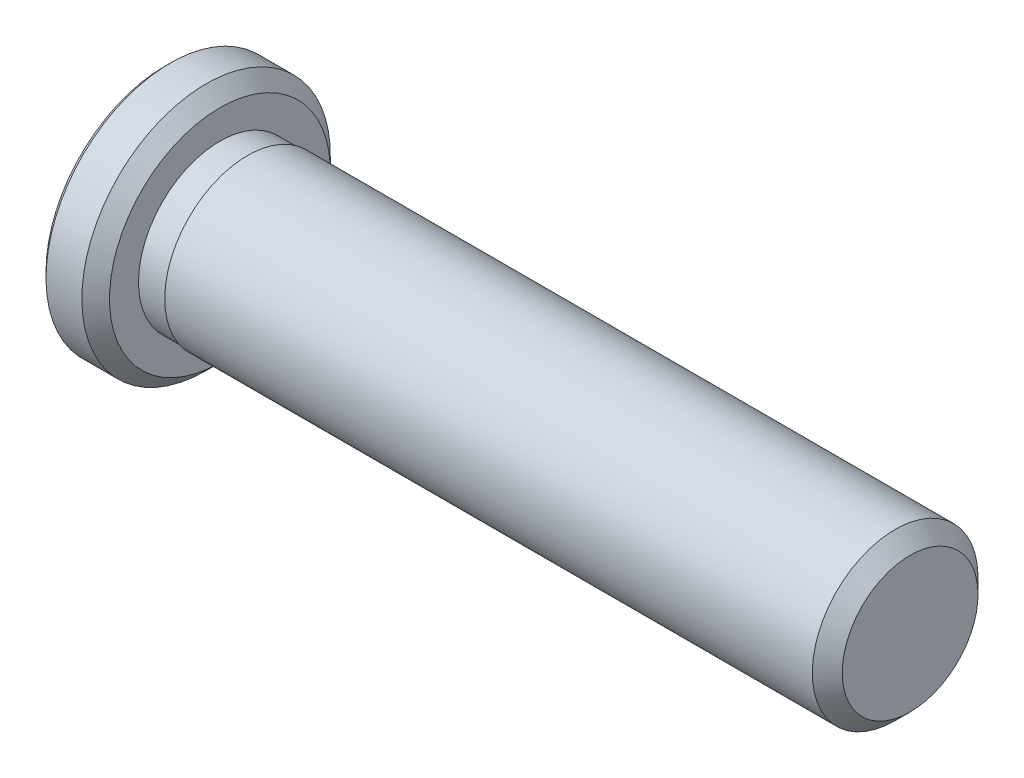
ISO-10303-21;
HEADER;
FILE_DESCRIPTION(('STEP AP214'),'2;1');
FILE_NAME('part.step','',(''),(''),'','','');
FILE_SCHEMA(('AUTOMOTIVE_DESIGN { 1 0 10303 214 1 1 1 1 }'));
ENDSEC;
DATA;
#1=APPLICATION_CONTEXT('core data for automotive mechanical design processes');
#2=APPLICATION_PROTOCOL_DEFINITION('international standard','automotive_design',2000,#1);
#3=PRODUCT_CONTEXT('',#1,'mechanical');
#4=PRODUCT('Part','Part','',(#3));
#5=PRODUCT_RELATED_PRODUCT_CATEGORY('part','',(#4));
#6=PRODUCT_DEFINITION_FORMATION('','',#4);
#7=PRODUCT_DEFINITION_CONTEXT('part definition',#1,'design');
#8=PRODUCT_DEFINITION('design','',#6,#7);
#9=PRODUCT_DEFINITION_SHAPE('','',#8);
#10=(LENGTH_UNIT() NAMED_UNIT(*) SI_UNIT(.MILLI.,.METRE.));
#11=(NAMED_UNIT(*) PLANE_ANGLE_UNIT() SI_UNIT($,.RADIAN.));
#12=(NAMED_UNIT(*) SI_UNIT($,.STERADIAN.) SOLID_ANGLE_UNIT());
#13=UNCERTAINTY_MEASURE_WITH_UNIT(LENGTH_MEASURE(1.E-05),#10,'distance_accuracy_value','');
#14=(GEOMETRIC_REPRESENTATION_CONTEXT(3) GLOBAL_UNCERTAINTY_ASSIGNED_CONTEXT((#13)) GLOBAL_UNIT_ASSIGNED_CONTEXT((#10,
#11,#12)) REPRESENTATION_CONTEXT('',''));
#15=CARTESIAN_POINT('',(0.,0.,0.));
#16=DIRECTION('',(0.,0.,1.));
#17=DIRECTION('',(1.,0.,0.));
#18=AXIS2_PLACEMENT_3D('',#15,#16,#17);
#19=CARTESIAN_POINT('',(-2.,0.,0.));
#20=DIRECTION('',(1.,0.,0.));
#21=DIRECTION('',(0.,1.,0.));
#22=AXIS2_PLACEMENT_3D('',#19,#20,#21);
#23=PLANE('',#22);
#24=DIRECTION('',(0.,0.,1.));
#25=VECTOR('',#24,1.);
#26=CARTESIAN_POINT('',(-2.,-1.5,-0.86602540378444));
#27=LINE('',#26,#25);
#28=CARTESIAN_POINT('',(-2.,-1.5,-0.86602540378444));
#29=VERTEX_POINT('',#28);
#30=CARTESIAN_POINT('',(-2.,-1.5,0.86602540378444));
#31=VERTEX_POINT('',#30);
#32=EDGE_CURVE('E105',#29,#31,#27,.T.);
#33=ORIENTED_EDGE('',*,*,#32,.F.);
#34=DIRECTION('',(0.,-0.866025403784433,0.500000000000009));
#35=VECTOR('',#34,1.);
#36=CARTESIAN_POINT('',(-2.,0.,-1.7320508075689));
#37=LINE('',#36,#35);
#38=CARTESIAN_POINT('',(-2.,0.,-1.7320508075689));
#39=VERTEX_POINT('',#38);
#40=EDGE_CURVE('E31',#39,#29,#37,.T.);
#41=ORIENTED_EDGE('',*,*,#40,.F.);
#42=DIRECTION('',(0.,-0.866025403784433,-0.500000000000009));
#43=VECTOR('',#42,1.);
#44=CARTESIAN_POINT('',(-2.,1.5,-0.86602540378444));
#45=LINE('',#44,#43);
#46=CARTESIAN_POINT('',(-2.,1.5,-0.86602540378444));
#47=VERTEX_POINT('',#46);
#48=EDGE_CURVE('E114',#47,#39,#45,.T.);
#49=ORIENTED_EDGE('',*,*,#48,.F.);
#50=DIRECTION('',(0.,0.,-1.));
#51=VECTOR('',#50,1.);
#52=CARTESIAN_POINT('',(-2.,1.5,0.86602540378444));
#53=LINE('',#52,#51);
#54=CARTESIAN_POINT('',(-2.,1.5,0.86602540378444));
#55=VERTEX_POINT('',#54);
#56=EDGE_CURVE('E112',#55,#47,#53,.T.);
#57=ORIENTED_EDGE('',*,*,#56,.F.);
#58=DIRECTION('',(0.,0.866025403784433,-0.500000000000009));
#59=VECTOR('',#58,1.);
#60=CARTESIAN_POINT('',(-2.,0.,1.7320508075689));
#61=LINE('',#60,#59);
#62=CARTESIAN_POINT('',(-2.,0.,1.7320508075689));
#63=VERTEX_POINT('',#62);
#64=EDGE_CURVE('E79',#63,#55,#61,.T.);
#65=ORIENTED_EDGE('',*,*,#64,.F.);
#66=DIRECTION('',(0.,0.866025403784433,0.500000000000009));
#67=VECTOR('',#66,1.);
#68=CARTESIAN_POINT('',(-2.,-1.5,0.86602540378444));
#69=LINE('',#68,#67);
#70=EDGE_CURVE('E108',#31,#63,#69,.T.);
#71=ORIENTED_EDGE('',*,*,#70,.F.);
#72=EDGE_LOOP('',(#33,#41,#49,#57,#65,#71));
#73=FACE_BOUND('',#72,.T.);
#74=CARTESIAN_POINT('',(-2.,0.,0.));
#75=DIRECTION('',(-1.,0.,0.));
#76=DIRECTION('',(0.,-1.,0.));
#77=AXIS2_PLACEMENT_3D('',#74,#75,#76);
#78=CIRCLE('',#77,4.3);
#79=CARTESIAN_POINT('',(-2.,-4.3,0.));
#80=VERTEX_POINT('',#79);
#81=EDGE_CURVE('E11',#80,#80,#78,.T.);
#82=ORIENTED_EDGE('',*,*,#81,.T.);
#83=EDGE_LOOP('',(#82));
#84=FACE_BOUND('',#83,.T.);
#85=ADVANCED_FACE('F17',(#73,#84),#23,.F.);
#86=CARTESIAN_POINT('',(-1.8,0.,0.));
#87=DIRECTION('',(1.,0.,0.));
#88=DIRECTION('',(0.,1.,0.));
#89=AXIS2_PLACEMENT_3D('',#86,#87,#88);
#90=CONICAL_SURFACE('',#89,4.5,0.785398163397442);
#91=ORIENTED_EDGE('',*,*,#81,.F.);
#92=EDGE_LOOP('',(#91));
#93=FACE_BOUND('',#92,.T.);
#94=CARTESIAN_POINT('',(-1.8,0.,0.));
#95=DIRECTION('',(-1.,0.,0.));
#96=DIRECTION('',(0.,-1.,0.));
#97=AXIS2_PLACEMENT_3D('',#94,#95,#96);
#98=CIRCLE('',#97,4.5);
#99=CARTESIAN_POINT('',(-1.8,-4.5,0.));
#100=VERTEX_POINT('',#99);
#101=EDGE_CURVE('E24',#100,#100,#98,.T.);
#102=ORIENTED_EDGE('',*,*,#101,.T.);
#103=EDGE_LOOP('',(#102));
#104=FACE_BOUND('',#103,.T.);
#105=ADVANCED_FACE('F146',(#93,#104),#90,.T.);
#106=CARTESIAN_POINT('',(25.,0.,0.));
#107=DIRECTION('',(-1.,0.,0.));
#108=DIRECTION('',(0.,-1.,0.));
#109=AXIS2_PLACEMENT_3D('',#106,#107,#108);
#110=CYLINDRICAL_SURFACE('',#109,4.5);
#111=ORIENTED_EDGE('',*,*,#101,.F.);
#112=EDGE_LOOP('',(#111));
#113=FACE_BOUND('',#112,.T.);
#114=CARTESIAN_POINT('',(-0.5,0.,0.));
#115=DIRECTION('',(-1.,0.,0.));
#116=DIRECTION('',(0.,-1.,0.));
#117=AXIS2_PLACEMENT_3D('',#114,#115,#116);
#118=CIRCLE('',#117,4.5);
#119=CARTESIAN_POINT('',(-0.5,-4.5,0.));
#120=VERTEX_POINT('',#119);
#121=EDGE_CURVE('E141',#120,#120,#118,.T.);
#122=ORIENTED_EDGE('',*,*,#121,.T.);
#123=EDGE_LOOP('',(#122));
#124=FACE_BOUND('',#123,.T.);
#125=ADVANCED_FACE('F148',(#113,#124),#110,.T.);
#126=CARTESIAN_POINT('',(0.,0.,0.));
#127=DIRECTION('',(-1.,0.,0.));
#128=DIRECTION('',(0.,-1.,0.));
#129=AXIS2_PLACEMENT_3D('',#126,#127,#128);
#130=CONICAL_SURFACE('',#129,4.,0.785398163397448);
#131=ORIENTED_EDGE('',*,*,#121,.F.);
#132=EDGE_LOOP('',(#131));
#133=FACE_BOUND('',#132,.T.);
#134=CARTESIAN_POINT('',(0.,0.,0.));
#135=DIRECTION('',(-1.,0.,0.));
#136=DIRECTION('',(0.,-1.,0.));
#137=AXIS2_PLACEMENT_3D('',#134,#135,#136);
#138=CIRCLE('',#137,4.);
#139=CARTESIAN_POINT('',(0.,-4.,0.));
#140=VERTEX_POINT('',#139);
#141=EDGE_CURVE('E138',#140,#140,#138,.T.);
#142=ORIENTED_EDGE('',*,*,#141,.T.);
#143=EDGE_LOOP('',(#142));
#144=FACE_BOUND('',#143,.T.);
#145=ADVANCED_FACE('F151',(#133,#144),#130,.T.);
#146=CARTESIAN_POINT('',(0.,4.,0.));
#147=DIRECTION('',(-1.,0.,0.));
#148=DIRECTION('',(0.,-1.,0.));
#149=AXIS2_PLACEMENT_3D('',#146,#147,#148);
#150=PLANE('',#149);
#151=ORIENTED_EDGE('',*,*,#141,.F.);
#152=EDGE_LOOP('',(#151));
#153=FACE_BOUND('',#152,.T.);
#154=CARTESIAN_POINT('',(0.,0.,0.));
#155=DIRECTION('',(-1.,0.,0.));
#156=DIRECTION('',(0.,-1.,0.));
#157=AXIS2_PLACEMENT_3D('',#154,#155,#156);
#158=CIRCLE('',#157,2.95);
#159=CARTESIAN_POINT('',(0.,-2.95,0.));
#160=VERTEX_POINT('',#159);
#161=EDGE_CURVE('E135',#160,#160,#158,.T.);
#162=ORIENTED_EDGE('',*,*,#161,.T.);
#163=EDGE_LOOP('',(#162));
#164=FACE_BOUND('',#163,.T.);
#165=ADVANCED_FACE('F157',(#153,#164),#150,.F.);
#166=CARTESIAN_POINT('',(25.,0.,0.));
#167=DIRECTION('',(-1.,0.,0.));
#168=DIRECTION('',(0.,-1.,0.));
#169=AXIS2_PLACEMENT_3D('',#166,#167,#168);
#170=CYLINDRICAL_SURFACE('',#169,2.95);
#171=ORIENTED_EDGE('',*,*,#161,.F.);
#172=EDGE_LOOP('',(#171));
#173=FACE_BOUND('',#172,.T.);
#174=CARTESIAN_POINT('',(1.,0.,0.));
#175=DIRECTION('',(-1.,0.,0.));
#176=DIRECTION('',(0.,-1.,0.));
#177=AXIS2_PLACEMENT_3D('',#174,#175,#176);
#178=CIRCLE('',#177,2.95);
#179=CARTESIAN_POINT('',(1.,-2.95,0.));
#180=VERTEX_POINT('',#179);
#181=EDGE_CURVE('E132',#180,#180,#178,.T.);
#182=ORIENTED_EDGE('',*,*,#181,.T.);
#183=EDGE_LOOP('',(#182));
#184=FACE_BOUND('',#183,.T.);
#185=ADVANCED_FACE('F163',(#173,#184),#170,.T.);
#186=CARTESIAN_POINT('',(1.,2.95,0.));
#187=DIRECTION('',(1.,0.,0.));
#188=DIRECTION('',(0.,1.,0.));
#189=AXIS2_PLACEMENT_3D('',#186,#187,#188);
#190=PLANE('',#189);
#191=ORIENTED_EDGE('',*,*,#181,.F.);
#192=EDGE_LOOP('',(#191));
#193=FACE_BOUND('',#192,.T.);
#194=CARTESIAN_POINT('',(1.,0.,0.));
#195=DIRECTION('',(-1.,0.,0.));
#196=DIRECTION('',(0.,-1.,0.));
#197=AXIS2_PLACEMENT_3D('',#194,#195,#196);
#198=CIRCLE('',#197,3.);
#199=CARTESIAN_POINT('',(1.,-3.,0.));
#200=VERTEX_POINT('',#199);
#201=EDGE_CURVE('E129',#200,#200,#198,.T.);
#202=ORIENTED_EDGE('',*,*,#201,.T.);
#203=EDGE_LOOP('',(#202));
#204=FACE_BOUND('',#203,.T.);
#205=ADVANCED_FACE('F169',(#193,#204),#190,.F.);
#206=CARTESIAN_POINT('',(25.,0.,0.));
#207=DIRECTION('',(-1.,0.,0.));
#208=DIRECTION('',(0.,-1.,0.));
#209=AXIS2_PLACEMENT_3D('',#206,#207,#208);
#210=CYLINDRICAL_SURFACE('',#209,3.);
#211=ORIENTED_EDGE('',*,*,#201,.F.);
#212=EDGE_LOOP('',(#211));
#213=FACE_BOUND('',#212,.T.);
#214=CARTESIAN_POINT('',(24.4585,0.,0.));
#215=DIRECTION('',(-1.,0.,0.));
#216=DIRECTION('',(0.,-1.,0.));
#217=AXIS2_PLACEMENT_3D('',#214,#215,#216);
#218=CIRCLE('',#217,3.);
#219=CARTESIAN_POINT('',(24.4585,-3.,0.));
#220=VERTEX_POINT('',#219);
#221=EDGE_CURVE('E126',#220,#220,#218,.T.);
#222=ORIENTED_EDGE('',*,*,#221,.T.);
#223=EDGE_LOOP('',(#222));
#224=FACE_BOUND('',#223,.T.);
#225=ADVANCED_FACE('F175',(#213,#224),#210,.T.);
#226=CARTESIAN_POINT('',(25.,0.,0.));
#227=DIRECTION('',(-1.,0.,0.));
#228=DIRECTION('',(0.,-1.,0.));
#229=AXIS2_PLACEMENT_3D('',#226,#227,#228);
#230=CONICAL_SURFACE('',#229,2.4585,0.785398163397448);
#231=ORIENTED_EDGE('',*,*,#221,.F.);
#232=EDGE_LOOP('',(#231));
#233=FACE_BOUND('',#232,.T.);
#234=CARTESIAN_POINT('',(25.,0.,0.));
#235=DIRECTION('',(-1.,0.,0.));
#236=DIRECTION('',(0.,-1.,0.));
#237=AXIS2_PLACEMENT_3D('',#234,#235,#236);
#238=CIRCLE('',#237,2.4585);
#239=CARTESIAN_POINT('',(25.,-2.4585,0.));
#240=VERTEX_POINT('',#239);
#241=EDGE_CURVE('E118',#240,#240,#238,.T.);
#242=ORIENTED_EDGE('',*,*,#241,.T.);
#243=EDGE_LOOP('',(#242));
#244=FACE_BOUND('',#243,.T.);
#245=ADVANCED_FACE('F181',(#233,#244),#230,.T.);
#246=CARTESIAN_POINT('',(25.,2.4585,0.));
#247=DIRECTION('',(-1.,0.,0.));
#248=DIRECTION('',(0.,-1.,0.));
#249=AXIS2_PLACEMENT_3D('',#246,#247,#248);
#250=PLANE('',#249);
#251=ORIENTED_EDGE('',*,*,#241,.F.);
#252=EDGE_LOOP('',(#251));
#253=FACE_BOUND('',#252,.T.);
#254=ADVANCED_FACE('F187',(#253),#250,.F.);
#255=CARTESIAN_POINT('',(-0.6,0.,-1.7320508075689));
#256=DIRECTION('',(0.,-0.500000000000009,-0.866025403784433));
#257=DIRECTION('',(0.,0.866025403784433,-0.500000000000009));
#258=AXIS2_PLACEMENT_3D('',#255,#256,#257);
#259=PLANE('',#258);
#260=ORIENTED_EDGE('',*,*,#40,.T.);
#261=DIRECTION('',(-1.,0.,0.));
#262=VECTOR('',#261,1.);
#263=CARTESIAN_POINT('',(-0.6,-1.5,-0.86602540378444));
#264=LINE('',#263,#262);
#265=CARTESIAN_POINT('',(-0.6,-1.5,-0.86602540378444));
#266=VERTEX_POINT('',#265);
#267=EDGE_CURVE('E61',#266,#29,#264,.T.);
#268=ORIENTED_EDGE('',*,*,#267,.F.);
#269=DIRECTION('',(0.,-0.866025403784433,0.500000000000009));
#270=VECTOR('',#269,1.);
#271=CARTESIAN_POINT('',(-0.6,0.,-1.7320508075689));
#272=LINE('',#271,#270);
#273=CARTESIAN_POINT('',(-0.6,0.,-1.7320508075689));
#274=VERTEX_POINT('',#273);
#275=EDGE_CURVE('E116',#274,#266,#272,.T.);
#276=ORIENTED_EDGE('',*,*,#275,.F.);
#277=DIRECTION('',(-1.,0.,0.));
#278=VECTOR('',#277,1.);
#279=CARTESIAN_POINT('',(-0.6,0.,-1.7320508075689));
#280=LINE('',#279,#278);
#281=EDGE_CURVE('E39',#274,#39,#280,.T.);
#282=ORIENTED_EDGE('',*,*,#281,.T.);
#283=EDGE_LOOP('',(#260,#268,#276,#282));
#284=FACE_BOUND('',#283,.T.);
#285=ADVANCED_FACE('F192',(#284),#259,.F.);
#286=CARTESIAN_POINT('',(-0.6,1.5,-0.86602540378444));
#287=DIRECTION('',(0.,0.500000000000009,-0.866025403784433));
#288=DIRECTION('',(0.,0.866025403784433,0.500000000000009));
#289=AXIS2_PLACEMENT_3D('',#286,#287,#288);
#290=PLANE('',#289);
#291=ORIENTED_EDGE('',*,*,#48,.T.);
#292=ORIENTED_EDGE('',*,*,#281,.F.);
#293=DIRECTION('',(0.,-0.866025403784433,-0.500000000000009));
#294=VECTOR('',#293,1.);
#295=CARTESIAN_POINT('',(-0.6,1.5,-0.86602540378444));
#296=LINE('',#295,#294);
#297=CARTESIAN_POINT('',(-0.6,1.5,-0.86602540378444));
#298=VERTEX_POINT('',#297);
#299=EDGE_CURVE('E91',#298,#274,#296,.T.);
#300=ORIENTED_EDGE('',*,*,#299,.F.);
#301=DIRECTION('',(-1.,0.,0.));
#302=VECTOR('',#301,1.);
#303=CARTESIAN_POINT('',(-0.6,1.5,-0.86602540378444));
#304=LINE('',#303,#302);
#305=EDGE_CURVE('E83',#298,#47,#304,.T.);
#306=ORIENTED_EDGE('',*,*,#305,.T.);
#307=EDGE_LOOP('',(#291,#292,#300,#306));
#308=FACE_BOUND('',#307,.T.);
#309=ADVANCED_FACE('F199',(#308),#290,.F.);
#310=CARTESIAN_POINT('',(-0.6,1.5,0.86602540378444));
#311=DIRECTION('',(0.,1.,0.));
#312=DIRECTION('',(0.,0.,1.));
#313=AXIS2_PLACEMENT_3D('',#310,#311,#312);
#314=PLANE('',#313);
#315=ORIENTED_EDGE('',*,*,#56,.T.);
#316=ORIENTED_EDGE('',*,*,#305,.F.);
#317=DIRECTION('',(0.,0.,-1.));
#318=VECTOR('',#317,1.);
#319=CARTESIAN_POINT('',(-0.6,1.5,0.86602540378444));
#320=LINE('',#319,#318);
#321=CARTESIAN_POINT('',(-0.6,1.5,0.86602540378444));
#322=VERTEX_POINT('',#321);
#323=EDGE_CURVE('E87',#322,#298,#320,.T.);
#324=ORIENTED_EDGE('',*,*,#323,.F.);
#325=DIRECTION('',(-1.,0.,0.));
#326=VECTOR('',#325,1.);
#327=CARTESIAN_POINT('',(-0.6,1.5,0.86602540378444));
#328=LINE('',#327,#326);
#329=EDGE_CURVE('E72',#322,#55,#328,.T.);
#330=ORIENTED_EDGE('',*,*,#329,.T.);
#331=EDGE_LOOP('',(#315,#316,#324,#330));
#332=FACE_BOUND('',#331,.T.);
#333=ADVANCED_FACE('F88',(#332),#314,.F.);
#334=CARTESIAN_POINT('',(-0.6,0.,1.7320508075689));
#335=DIRECTION('',(0.,0.500000000000009,0.866025403784433));
#336=DIRECTION('',(0.,-0.866025403784433,0.500000000000009));
#337=AXIS2_PLACEMENT_3D('',#334,#335,#336);
#338=PLANE('',#337);
#339=ORIENTED_EDGE('',*,*,#64,.T.);
#340=ORIENTED_EDGE('',*,*,#329,.F.);
#341=DIRECTION('',(0.,0.866025403784433,-0.500000000000009));
#342=VECTOR('',#341,1.);
#343=CARTESIAN_POINT('',(-0.6,0.,1.7320508075689));
#344=LINE('',#343,#342);
#345=CARTESIAN_POINT('',(-0.6,0.,1.7320508075689));
#346=VERTEX_POINT('',#345);
#347=EDGE_CURVE('E76',#346,#322,#344,.T.);
#348=ORIENTED_EDGE('',*,*,#347,.F.);
#349=DIRECTION('',(-1.,0.,0.));
#350=VECTOR('',#349,1.);
#351=CARTESIAN_POINT('',(-0.6,0.,1.7320508075689));
#352=LINE('',#351,#350);
#353=EDGE_CURVE('E84',#346,#63,#352,.T.);
#354=ORIENTED_EDGE('',*,*,#353,.T.);
#355=EDGE_LOOP('',(#339,#340,#348,#354));
#356=FACE_BOUND('',#355,.T.);
#357=ADVANCED_FACE('F74',(#356),#338,.F.);
#358=CARTESIAN_POINT('',(-0.6,-1.5,0.86602540378444));
#359=DIRECTION('',(0.,-0.500000000000009,0.866025403784433));
#360=DIRECTION('',(0.,-0.866025403784433,-0.500000000000009));
#361=AXIS2_PLACEMENT_3D('',#358,#359,#360);
#362=PLANE('',#361);
#363=ORIENTED_EDGE('',*,*,#70,.T.);
#364=ORIENTED_EDGE('',*,*,#353,.F.);
#365=DIRECTION('',(0.,0.866025403784433,0.500000000000009));
#366=VECTOR('',#365,1.);
#367=CARTESIAN_POINT('',(-0.6,-1.5,0.86602540378444));
#368=LINE('',#367,#366);
#369=CARTESIAN_POINT('',(-0.6,-1.5,0.86602540378444));
#370=VERTEX_POINT('',#369);
#371=EDGE_CURVE('E97',#370,#346,#368,.T.);
#372=ORIENTED_EDGE('',*,*,#371,.F.);
#373=DIRECTION('',(-1.,0.,0.));
#374=VECTOR('',#373,1.);
#375=CARTESIAN_POINT('',(-0.6,-1.5,0.86602540378444));
#376=LINE('',#375,#374);
#377=EDGE_CURVE('E121',#370,#31,#376,.T.);
#378=ORIENTED_EDGE('',*,*,#377,.T.);
#379=EDGE_LOOP('',(#363,#364,#372,#378));
#380=FACE_BOUND('',#379,.T.);
#381=ADVANCED_FACE('F227',(#380),#362,.F.);
#382=CARTESIAN_POINT('',(-0.6,-1.5,-0.86602540378444));
#383=DIRECTION('',(0.,-1.,0.));
#384=DIRECTION('',(0.,0.,-1.));
#385=AXIS2_PLACEMENT_3D('',#382,#383,#384);
#386=PLANE('',#385);
#387=ORIENTED_EDGE('',*,*,#32,.T.);
#388=ORIENTED_EDGE('',*,*,#377,.F.);
#389=DIRECTION('',(0.,0.,1.));
#390=VECTOR('',#389,1.);
#391=CARTESIAN_POINT('',(-0.6,-1.5,-0.86602540378444));
#392=LINE('',#391,#390);
#393=EDGE_CURVE('E99',#266,#370,#392,.T.);
#394=ORIENTED_EDGE('',*,*,#393,.F.);
#395=ORIENTED_EDGE('',*,*,#267,.T.);
#396=EDGE_LOOP('',(#387,#388,#394,#395));
#397=FACE_BOUND('',#396,.T.);
#398=ADVANCED_FACE('F214',(#397),#386,.F.);
#399=CARTESIAN_POINT('',(-0.6,-1.5,-0.86602540378444));
#400=DIRECTION('',(-1.,0.,0.));
#401=DIRECTION('',(0.,0.,1.));
#402=AXIS2_PLACEMENT_3D('',#399,#400,#401);
#403=PLANE('',#402);
#404=ORIENTED_EDGE('',*,*,#275,.T.);
#405=ORIENTED_EDGE('',*,*,#393,.T.);
#406=ORIENTED_EDGE('',*,*,#371,.T.);
#407=ORIENTED_EDGE('',*,*,#347,.T.);
#408=ORIENTED_EDGE('',*,*,#323,.T.);
#409=ORIENTED_EDGE('',*,*,#299,.T.);
#410=EDGE_LOOP('',(#404,#405,#406,#407,#408,#409));
#411=FACE_BOUND('',#410,.T.);
#412=ADVANCED_FACE('F94',(#411),#403,.T.);
#413=CLOSED_SHELL('',(#85,#105,#125,#145,#165,#185,#205,#225,#245,#254,#285,#309,#333,#357,#381,
#398,#412));
#414=MANIFOLD_SOLID_BREP('B1',#413);
#415=ADVANCED_BREP_SHAPE_REPRESENTATION('',(#18,#414),#14);
#416=SHAPE_DEFINITION_REPRESENTATION(#9,#415);
ENDSEC;
END-ISO-10303-21;
